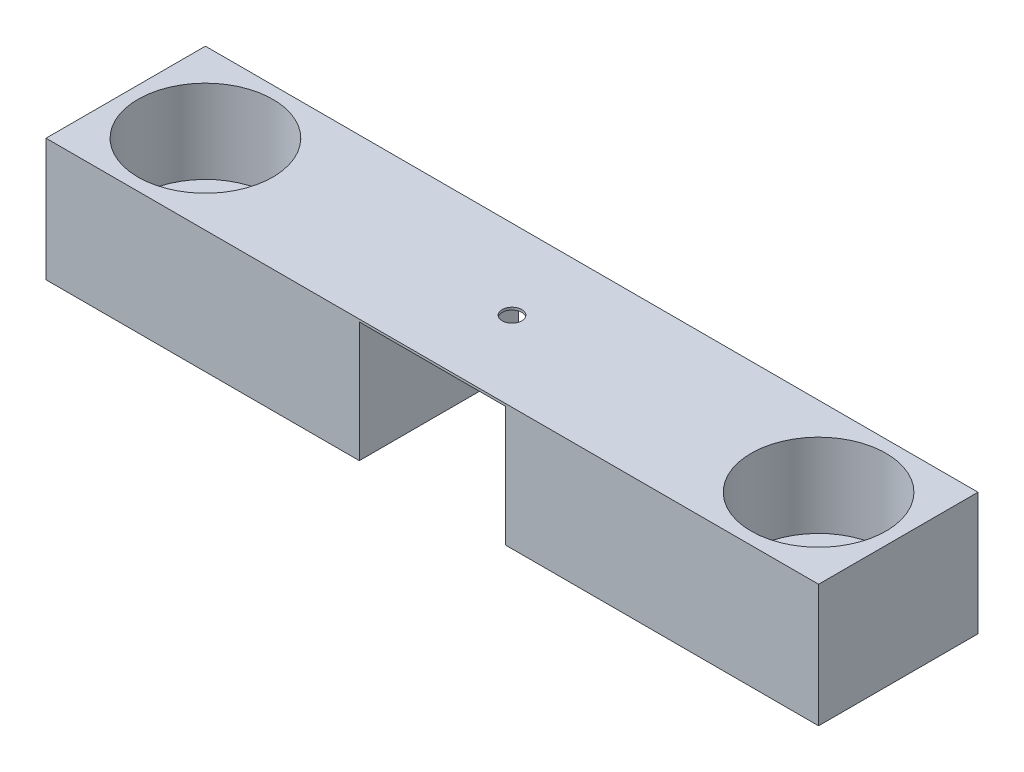
ISO-10303-21;
HEADER;
FILE_DESCRIPTION(('STEP AP214'),'2;1');
FILE_NAME('part.step','',(''),(''),'','','');
FILE_SCHEMA(('AUTOMOTIVE_DESIGN { 1 0 10303 214 1 1 1 1 }'));
ENDSEC;
DATA;
#1=APPLICATION_CONTEXT('core data for automotive mechanical design processes');
#2=APPLICATION_PROTOCOL_DEFINITION('international standard','automotive_design',2000,#1);
#3=PRODUCT_CONTEXT('',#1,'mechanical');
#4=PRODUCT('Part','Part','',(#3));
#5=PRODUCT_RELATED_PRODUCT_CATEGORY('part','',(#4));
#6=PRODUCT_DEFINITION_FORMATION('','',#4);
#7=PRODUCT_DEFINITION_CONTEXT('part definition',#1,'design');
#8=PRODUCT_DEFINITION('design','',#6,#7);
#9=PRODUCT_DEFINITION_SHAPE('','',#8);
#10=(LENGTH_UNIT() NAMED_UNIT(*) SI_UNIT(.MILLI.,.METRE.));
#11=(NAMED_UNIT(*) PLANE_ANGLE_UNIT() SI_UNIT($,.RADIAN.));
#12=(NAMED_UNIT(*) SI_UNIT($,.STERADIAN.) SOLID_ANGLE_UNIT());
#13=UNCERTAINTY_MEASURE_WITH_UNIT(LENGTH_MEASURE(1.E-05),#10,'distance_accuracy_value','');
#14=(GEOMETRIC_REPRESENTATION_CONTEXT(3) GLOBAL_UNCERTAINTY_ASSIGNED_CONTEXT((#13)) GLOBAL_UNIT_ASSIGNED_CONTEXT((#10,
#11,#12)) REPRESENTATION_CONTEXT('',''));
#15=CARTESIAN_POINT('',(0.,0.,0.));
#16=DIRECTION('',(0.,0.,1.));
#17=DIRECTION('',(1.,0.,0.));
#18=AXIS2_PLACEMENT_3D('',#15,#16,#17);
#19=CARTESIAN_POINT('',(0.,0.,0.));
#20=DIRECTION('',(0.,1.,0.));
#21=DIRECTION('',(0.,0.,1.));
#22=AXIS2_PLACEMENT_3D('',#19,#20,#21);
#23=PLANE('',#22);
#24=CARTESIAN_POINT('',(-25.,0.,0.));
#25=DIRECTION('',(0.,1.,0.));
#26=DIRECTION('',(0.,0.,1.));
#27=AXIS2_PLACEMENT_3D('',#24,#25,#26);
#28=CIRCLE('',#27,3.3);
#29=CARTESIAN_POINT('',(-25.,0.,3.3));
#30=VERTEX_POINT('',#29);
#31=EDGE_CURVE('E260',#30,#30,#28,.T.);
#32=ORIENTED_EDGE('',*,*,#31,.T.);
#33=EDGE_LOOP('',(#32));
#34=FACE_BOUND('',#33,.T.);
#35=CARTESIAN_POINT('',(-15.,0.,0.));
#36=DIRECTION('',(0.,-1.,0.));
#37=DIRECTION('',(0.,0.,-1.));
#38=AXIS2_PLACEMENT_3D('',#35,#36,#37);
#39=CIRCLE('',#38,1.99999999999999);
#40=CARTESIAN_POINT('',(-15.,0.,-1.99999999999999));
#41=VERTEX_POINT('',#40);
#42=EDGE_CURVE('E240',#41,#41,#39,.T.);
#43=ORIENTED_EDGE('',*,*,#42,.F.);
#44=EDGE_LOOP('',(#43));
#45=FACE_BOUND('',#44,.T.);
#46=DIRECTION('',(-1.,0.,0.));
#47=VECTOR('',#46,1.);
#48=CARTESIAN_POINT('',(-31.5,0.,-6.5));
#49=LINE('',#48,#47);
#50=CARTESIAN_POINT('',(-5.95,0.,-6.5));
#51=VERTEX_POINT('',#50);
#52=CARTESIAN_POINT('',(-31.5,0.,-6.5));
#53=VERTEX_POINT('',#52);
#54=EDGE_CURVE('E150',#51,#53,#49,.T.);
#55=ORIENTED_EDGE('',*,*,#54,.F.);
#56=DIRECTION('',(0.,0.,1.));
#57=VECTOR('',#56,1.);
#58=CARTESIAN_POINT('',(-5.95,0.,-6.5));
#59=LINE('',#58,#57);
#60=CARTESIAN_POINT('',(-5.95,0.,6.5));
#61=VERTEX_POINT('',#60);
#62=EDGE_CURVE('E133',#51,#61,#59,.T.);
#63=ORIENTED_EDGE('',*,*,#62,.T.);
#64=DIRECTION('',(1.,0.,0.));
#65=VECTOR('',#64,1.);
#66=CARTESIAN_POINT('',(-31.5,0.,6.5));
#67=LINE('',#66,#65);
#68=CARTESIAN_POINT('',(-31.5,0.,6.5));
#69=VERTEX_POINT('',#68);
#70=EDGE_CURVE('E168',#69,#61,#67,.T.);
#71=ORIENTED_EDGE('',*,*,#70,.F.);
#72=DIRECTION('',(0.,0.,1.));
#73=VECTOR('',#72,1.);
#74=CARTESIAN_POINT('',(-31.5,0.,-6.5));
#75=LINE('',#74,#73);
#76=EDGE_CURVE('E156',#53,#69,#75,.T.);
#77=ORIENTED_EDGE('',*,*,#76,.F.);
#78=EDGE_LOOP('',(#55,#63,#71,#77));
#79=FACE_BOUND('',#78,.T.);
#80=ADVANCED_FACE('F40',(#34,#45,#79),#23,.F.);
#81=CARTESIAN_POINT('',(31.5,10.,-6.5));
#82=DIRECTION('',(-1.,0.,0.));
#83=DIRECTION('',(0.,0.,1.));
#84=AXIS2_PLACEMENT_3D('',#81,#82,#83);
#85=PLANE('',#84);
#86=DIRECTION('',(0.,0.,-1.));
#87=VECTOR('',#86,1.);
#88=CARTESIAN_POINT('',(31.5,0.,-6.5));
#89=LINE('',#88,#87);
#90=CARTESIAN_POINT('',(31.5,0.,6.5));
#91=VERTEX_POINT('',#90);
#92=CARTESIAN_POINT('',(31.5,0.,-6.5));
#93=VERTEX_POINT('',#92);
#94=EDGE_CURVE('E158',#91,#93,#89,.T.);
#95=ORIENTED_EDGE('',*,*,#94,.T.);
#96=DIRECTION('',(0.,-1.,0.));
#97=VECTOR('',#96,1.);
#98=CARTESIAN_POINT('',(31.5,10.,-6.5));
#99=LINE('',#98,#97);
#100=CARTESIAN_POINT('',(31.5,10.,-6.5));
#101=VERTEX_POINT('',#100);
#102=EDGE_CURVE('E11',#101,#93,#99,.T.);
#103=ORIENTED_EDGE('',*,*,#102,.F.);
#104=DIRECTION('',(0.,0.,-1.));
#105=VECTOR('',#104,1.);
#106=CARTESIAN_POINT('',(31.5,10.,-6.5));
#107=LINE('',#106,#105);
#108=CARTESIAN_POINT('',(31.5,10.,6.5));
#109=VERTEX_POINT('',#108);
#110=EDGE_CURVE('E170',#109,#101,#107,.T.);
#111=ORIENTED_EDGE('',*,*,#110,.F.);
#112=DIRECTION('',(0.,-1.,0.));
#113=VECTOR('',#112,1.);
#114=CARTESIAN_POINT('',(31.5,10.,6.5));
#115=LINE('',#114,#113);
#116=EDGE_CURVE('E171',#109,#91,#115,.T.);
#117=ORIENTED_EDGE('',*,*,#116,.T.);
#118=EDGE_LOOP('',(#95,#103,#111,#117));
#119=FACE_BOUND('',#118,.T.);
#120=ADVANCED_FACE('F42',(#119),#85,.F.);
#121=CARTESIAN_POINT('',(-31.5,10.,-6.5));
#122=DIRECTION('',(0.,0.,1.));
#123=DIRECTION('',(1.,0.,0.));
#124=AXIS2_PLACEMENT_3D('',#121,#122,#123);
#125=PLANE('',#124);
#126=DIRECTION('',(-1.,0.,0.));
#127=VECTOR('',#126,1.);
#128=CARTESIAN_POINT('',(-5.95,9.8,-6.5));
#129=LINE('',#128,#127);
#130=CARTESIAN_POINT('',(5.95,9.8,-6.5));
#131=VERTEX_POINT('',#130);
#132=CARTESIAN_POINT('',(-5.95,9.8,-6.5));
#133=VERTEX_POINT('',#132);
#134=EDGE_CURVE('E145',#131,#133,#129,.T.);
#135=ORIENTED_EDGE('',*,*,#134,.T.);
#136=DIRECTION('',(0.,-1.,0.));
#137=VECTOR('',#136,1.);
#138=CARTESIAN_POINT('',(-5.95,9.8,-6.5));
#139=LINE('',#138,#137);
#140=EDGE_CURVE('E136',#133,#51,#139,.T.);
#141=ORIENTED_EDGE('',*,*,#140,.T.);
#142=ORIENTED_EDGE('',*,*,#54,.T.);
#143=DIRECTION('',(0.,-1.,0.));
#144=VECTOR('',#143,1.);
#145=CARTESIAN_POINT('',(-31.5,10.,-6.5));
#146=LINE('',#145,#144);
#147=CARTESIAN_POINT('',(-31.5,10.,-6.5));
#148=VERTEX_POINT('',#147);
#149=EDGE_CURVE('E49',#148,#53,#146,.T.);
#150=ORIENTED_EDGE('',*,*,#149,.F.);
#151=DIRECTION('',(-1.,0.,0.));
#152=VECTOR('',#151,1.);
#153=CARTESIAN_POINT('',(-31.5,10.,-6.5));
#154=LINE('',#153,#152);
#155=EDGE_CURVE('E183',#101,#148,#154,.T.);
#156=ORIENTED_EDGE('',*,*,#155,.F.);
#157=ORIENTED_EDGE('',*,*,#102,.T.);
#158=CARTESIAN_POINT('',(5.95,0.,-6.5));
#159=VERTEX_POINT('',#158);
#160=EDGE_CURVE('E157',#93,#159,#49,.T.);
#161=ORIENTED_EDGE('',*,*,#160,.T.);
#162=DIRECTION('',(0.,1.,0.));
#163=VECTOR('',#162,1.);
#164=CARTESIAN_POINT('',(5.95,9.8,-6.5));
#165=LINE('',#164,#163);
#166=EDGE_CURVE('E56',#159,#131,#165,.T.);
#167=ORIENTED_EDGE('',*,*,#166,.T.);
#168=EDGE_LOOP('',(#135,#141,#142,#150,#156,#157,#161,#167));
#169=FACE_BOUND('',#168,.T.);
#170=ADVANCED_FACE('F148',(#169),#125,.F.);
#171=CARTESIAN_POINT('',(-31.5,10.,-6.5));
#172=DIRECTION('',(1.,0.,0.));
#173=DIRECTION('',(0.,0.,-1.));
#174=AXIS2_PLACEMENT_3D('',#171,#172,#173);
#175=PLANE('',#174);
#176=ORIENTED_EDGE('',*,*,#76,.T.);
#177=DIRECTION('',(0.,-1.,0.));
#178=VECTOR('',#177,1.);
#179=CARTESIAN_POINT('',(-31.5,10.,6.5));
#180=LINE('',#179,#178);
#181=CARTESIAN_POINT('',(-31.5,10.,6.5));
#182=VERTEX_POINT('',#181);
#183=EDGE_CURVE('E174',#182,#69,#180,.T.);
#184=ORIENTED_EDGE('',*,*,#183,.F.);
#185=DIRECTION('',(0.,0.,1.));
#186=VECTOR('',#185,1.);
#187=CARTESIAN_POINT('',(-31.5,10.,-6.5));
#188=LINE('',#187,#186);
#189=EDGE_CURVE('E182',#148,#182,#188,.T.);
#190=ORIENTED_EDGE('',*,*,#189,.F.);
#191=ORIENTED_EDGE('',*,*,#149,.T.);
#192=EDGE_LOOP('',(#176,#184,#190,#191));
#193=FACE_BOUND('',#192,.T.);
#194=ADVANCED_FACE('F180',(#193),#175,.F.);
#195=CARTESIAN_POINT('',(-31.5,10.,6.5));
#196=DIRECTION('',(0.,0.,-1.));
#197=DIRECTION('',(-1.,0.,0.));
#198=AXIS2_PLACEMENT_3D('',#195,#196,#197);
#199=PLANE('',#198);
#200=ORIENTED_EDGE('',*,*,#70,.T.);
#201=DIRECTION('',(0.,-1.,0.));
#202=VECTOR('',#201,1.);
#203=CARTESIAN_POINT('',(-5.95,9.8,6.5));
#204=LINE('',#203,#202);
#205=CARTESIAN_POINT('',(-5.95,9.8,6.5));
#206=VERTEX_POINT('',#205);
#207=EDGE_CURVE('E139',#206,#61,#204,.T.);
#208=ORIENTED_EDGE('',*,*,#207,.F.);
#209=DIRECTION('',(-1.,0.,0.));
#210=VECTOR('',#209,1.);
#211=CARTESIAN_POINT('',(-5.95,9.8,6.5));
#212=LINE('',#211,#210);
#213=CARTESIAN_POINT('',(5.95,9.8,6.5));
#214=VERTEX_POINT('',#213);
#215=EDGE_CURVE('E153',#214,#206,#212,.T.);
#216=ORIENTED_EDGE('',*,*,#215,.F.);
#217=DIRECTION('',(0.,1.,0.));
#218=VECTOR('',#217,1.);
#219=CARTESIAN_POINT('',(5.95,9.8,6.5));
#220=LINE('',#219,#218);
#221=CARTESIAN_POINT('',(5.95,0.,6.5));
#222=VERTEX_POINT('',#221);
#223=EDGE_CURVE('E202',#222,#214,#220,.T.);
#224=ORIENTED_EDGE('',*,*,#223,.F.);
#225=EDGE_CURVE('E167',#222,#91,#67,.T.);
#226=ORIENTED_EDGE('',*,*,#225,.T.);
#227=ORIENTED_EDGE('',*,*,#116,.F.);
#228=DIRECTION('',(1.,0.,0.));
#229=VECTOR('',#228,1.);
#230=CARTESIAN_POINT('',(-31.5,10.,6.5));
#231=LINE('',#230,#229);
#232=EDGE_CURVE('E175',#182,#109,#231,.T.);
#233=ORIENTED_EDGE('',*,*,#232,.F.);
#234=ORIENTED_EDGE('',*,*,#183,.T.);
#235=EDGE_LOOP('',(#200,#208,#216,#224,#226,#227,#233,#234));
#236=FACE_BOUND('',#235,.T.);
#237=ADVANCED_FACE('F275',(#236),#199,.F.);
#238=CARTESIAN_POINT('',(0.,10.,0.));
#239=DIRECTION('',(0.,1.,0.));
#240=DIRECTION('',(0.,0.,1.));
#241=AXIS2_PLACEMENT_3D('',#238,#239,#240);
#242=PLANE('',#241);
#243=CARTESIAN_POINT('',(0.,10.,0.));
#244=DIRECTION('',(0.,1.,0.));
#245=DIRECTION('',(0.,0.,1.));
#246=AXIS2_PLACEMENT_3D('',#243,#244,#245);
#247=CIRCLE('',#246,0.799999999999999);
#248=CARTESIAN_POINT('',(0.,10.,0.799999999999994));
#249=VERTEX_POINT('',#248);
#250=EDGE_CURVE('E212',#249,#249,#247,.T.);
#251=ORIENTED_EDGE('',*,*,#250,.F.);
#252=EDGE_LOOP('',(#251));
#253=FACE_BOUND('',#252,.T.);
#254=CARTESIAN_POINT('',(-25.,10.,0.));
#255=DIRECTION('',(0.,1.,0.));
#256=DIRECTION('',(0.,0.,1.));
#257=AXIS2_PLACEMENT_3D('',#254,#255,#256);
#258=CIRCLE('',#257,5.49999999999999);
#259=CARTESIAN_POINT('',(-25.,10.,5.49999999999999));
#260=VERTEX_POINT('',#259);
#261=EDGE_CURVE('E251',#260,#260,#258,.T.);
#262=ORIENTED_EDGE('',*,*,#261,.F.);
#263=EDGE_LOOP('',(#262));
#264=FACE_BOUND('',#263,.T.);
#265=CARTESIAN_POINT('',(25.,10.,0.));
#266=DIRECTION('',(0.,1.,0.));
#267=DIRECTION('',(0.,0.,1.));
#268=AXIS2_PLACEMENT_3D('',#265,#266,#267);
#269=CIRCLE('',#268,5.49999999999999);
#270=CARTESIAN_POINT('',(25.,10.,5.49999999999998));
#271=VERTEX_POINT('',#270);
#272=EDGE_CURVE('E263',#271,#271,#269,.T.);
#273=ORIENTED_EDGE('',*,*,#272,.F.);
#274=EDGE_LOOP('',(#273));
#275=FACE_BOUND('',#274,.T.);
#276=ORIENTED_EDGE('',*,*,#110,.T.);
#277=ORIENTED_EDGE('',*,*,#155,.T.);
#278=ORIENTED_EDGE('',*,*,#189,.T.);
#279=ORIENTED_EDGE('',*,*,#232,.T.);
#280=EDGE_LOOP('',(#276,#277,#278,#279));
#281=FACE_BOUND('',#280,.T.);
#282=ADVANCED_FACE('F189',(#253,#264,#275,#281),#242,.T.);
#283=DIRECTION('',(1.,0.,0.));
#284=VECTOR('',#283,1.);
#285=CARTESIAN_POINT('',(14.5,0.,-2.));
#286=LINE('',#285,#284);
#287=CARTESIAN_POINT('',(14.5,0.,-2.));
#288=VERTEX_POINT('',#287);
#289=CARTESIAN_POINT('',(15.5,0.,-2.));
#290=VERTEX_POINT('',#289);
#291=EDGE_CURVE('E230',#288,#290,#286,.T.);
#292=ORIENTED_EDGE('',*,*,#291,.F.);
#293=CARTESIAN_POINT('',(14.5,0.,0.));
#294=DIRECTION('',(0.,-1.,0.));
#295=DIRECTION('',(0.,0.,-1.));
#296=AXIS2_PLACEMENT_3D('',#293,#294,#295);
#297=CIRCLE('',#296,2.);
#298=CARTESIAN_POINT('',(14.5,0.,2.));
#299=VERTEX_POINT('',#298);
#300=EDGE_CURVE('E64',#299,#288,#297,.T.);
#301=ORIENTED_EDGE('',*,*,#300,.F.);
#302=DIRECTION('',(-1.,0.,0.));
#303=VECTOR('',#302,1.);
#304=CARTESIAN_POINT('',(14.5,0.,2.));
#305=LINE('',#304,#303);
#306=CARTESIAN_POINT('',(15.5,0.,2.));
#307=VERTEX_POINT('',#306);
#308=EDGE_CURVE('E219',#307,#299,#305,.T.);
#309=ORIENTED_EDGE('',*,*,#308,.F.);
#310=CARTESIAN_POINT('',(15.5,0.,0.));
#311=DIRECTION('',(0.,-1.,0.));
#312=DIRECTION('',(0.,0.,-1.));
#313=AXIS2_PLACEMENT_3D('',#310,#311,#312);
#314=CIRCLE('',#313,2.);
#315=EDGE_CURVE('E233',#290,#307,#314,.T.);
#316=ORIENTED_EDGE('',*,*,#315,.F.);
#317=EDGE_LOOP('',(#292,#301,#309,#316));
#318=FACE_BOUND('',#317,.T.);
#319=CARTESIAN_POINT('',(25.,0.,0.));
#320=DIRECTION('',(0.,1.,0.));
#321=DIRECTION('',(0.,0.,1.));
#322=AXIS2_PLACEMENT_3D('',#319,#320,#321);
#323=CIRCLE('',#322,3.3);
#324=CARTESIAN_POINT('',(25.,0.,3.29999999999999));
#325=VERTEX_POINT('',#324);
#326=EDGE_CURVE('E162',#325,#325,#323,.T.);
#327=ORIENTED_EDGE('',*,*,#326,.T.);
#328=EDGE_LOOP('',(#327));
#329=FACE_BOUND('',#328,.T.);
#330=ORIENTED_EDGE('',*,*,#225,.F.);
#331=DIRECTION('',(0.,0.,1.));
#332=VECTOR('',#331,1.);
#333=CARTESIAN_POINT('',(5.95,0.,-6.5));
#334=LINE('',#333,#332);
#335=EDGE_CURVE('E144',#159,#222,#334,.T.);
#336=ORIENTED_EDGE('',*,*,#335,.F.);
#337=ORIENTED_EDGE('',*,*,#160,.F.);
#338=ORIENTED_EDGE('',*,*,#94,.F.);
#339=EDGE_LOOP('',(#330,#336,#337,#338));
#340=FACE_BOUND('',#339,.T.);
#341=ADVANCED_FACE('F197',(#318,#329,#340),#23,.F.);
#342=CARTESIAN_POINT('',(25.,10.,0.));
#343=DIRECTION('',(0.,1.,0.));
#344=DIRECTION('',(0.,0.,1.));
#345=AXIS2_PLACEMENT_3D('',#342,#343,#344);
#346=CYLINDRICAL_SURFACE('',#345,3.3);
#347=ORIENTED_EDGE('',*,*,#326,.F.);
#348=EDGE_LOOP('',(#347));
#349=FACE_BOUND('',#348,.T.);
#350=CARTESIAN_POINT('',(25.,3.2,0.));
#351=DIRECTION('',(0.,1.,0.));
#352=DIRECTION('',(0.,0.,1.));
#353=AXIS2_PLACEMENT_3D('',#350,#351,#352);
#354=CIRCLE('',#353,3.3);
#355=CARTESIAN_POINT('',(25.,3.2,3.29999999999999));
#356=VERTEX_POINT('',#355);
#357=EDGE_CURVE('E269',#356,#356,#354,.T.);
#358=ORIENTED_EDGE('',*,*,#357,.T.);
#359=EDGE_LOOP('',(#358));
#360=FACE_BOUND('',#359,.T.);
#361=ADVANCED_FACE('F314',(#349,#360),#346,.F.);
#362=CARTESIAN_POINT('',(28.3,3.2,0.));
#363=DIRECTION('',(0.,-1.,0.));
#364=DIRECTION('',(0.,0.,-1.));
#365=AXIS2_PLACEMENT_3D('',#362,#363,#364);
#366=PLANE('',#365);
#367=ORIENTED_EDGE('',*,*,#357,.F.);
#368=EDGE_LOOP('',(#367));
#369=FACE_BOUND('',#368,.T.);
#370=CARTESIAN_POINT('',(25.,3.2,0.));
#371=DIRECTION('',(0.,1.,0.));
#372=DIRECTION('',(0.,0.,1.));
#373=AXIS2_PLACEMENT_3D('',#370,#371,#372);
#374=CIRCLE('',#373,5.5);
#375=CARTESIAN_POINT('',(25.,3.2,5.49999999999999));
#376=VERTEX_POINT('',#375);
#377=EDGE_CURVE('E266',#376,#376,#374,.T.);
#378=ORIENTED_EDGE('',*,*,#377,.T.);
#379=EDGE_LOOP('',(#378));
#380=FACE_BOUND('',#379,.T.);
#381=ADVANCED_FACE('F304',(#369,#380),#366,.F.);
#382=CARTESIAN_POINT('',(25.,10.,0.));
#383=DIRECTION('',(0.,1.,0.));
#384=DIRECTION('',(0.,0.,1.));
#385=AXIS2_PLACEMENT_3D('',#382,#383,#384);
#386=CYLINDRICAL_SURFACE('',#385,5.5);
#387=ORIENTED_EDGE('',*,*,#377,.F.);
#388=EDGE_LOOP('',(#387));
#389=FACE_BOUND('',#388,.T.);
#390=ORIENTED_EDGE('',*,*,#272,.T.);
#391=EDGE_LOOP('',(#390));
#392=FACE_BOUND('',#391,.T.);
#393=ADVANCED_FACE('F301',(#389,#392),#386,.F.);
#394=CARTESIAN_POINT('',(-25.,10.,0.));
#395=DIRECTION('',(0.,1.,0.));
#396=DIRECTION('',(0.,0.,1.));
#397=AXIS2_PLACEMENT_3D('',#394,#395,#396);
#398=CYLINDRICAL_SURFACE('',#397,3.3);
#399=ORIENTED_EDGE('',*,*,#31,.F.);
#400=EDGE_LOOP('',(#399));
#401=FACE_BOUND('',#400,.T.);
#402=CARTESIAN_POINT('',(-25.,3.2,0.));
#403=DIRECTION('',(0.,1.,0.));
#404=DIRECTION('',(0.,0.,1.));
#405=AXIS2_PLACEMENT_3D('',#402,#403,#404);
#406=CIRCLE('',#405,3.3);
#407=CARTESIAN_POINT('',(-25.,3.2,3.3));
#408=VERTEX_POINT('',#407);
#409=EDGE_CURVE('E257',#408,#408,#406,.T.);
#410=ORIENTED_EDGE('',*,*,#409,.T.);
#411=EDGE_LOOP('',(#410));
#412=FACE_BOUND('',#411,.T.);
#413=ADVANCED_FACE('F303',(#401,#412),#398,.F.);
#414=CARTESIAN_POINT('',(-21.7,3.2,0.));
#415=DIRECTION('',(0.,-1.,0.));
#416=DIRECTION('',(0.,0.,-1.));
#417=AXIS2_PLACEMENT_3D('',#414,#415,#416);
#418=PLANE('',#417);
#419=ORIENTED_EDGE('',*,*,#409,.F.);
#420=EDGE_LOOP('',(#419));
#421=FACE_BOUND('',#420,.T.);
#422=CARTESIAN_POINT('',(-25.,3.2,0.));
#423=DIRECTION('',(0.,1.,0.));
#424=DIRECTION('',(0.,0.,1.));
#425=AXIS2_PLACEMENT_3D('',#422,#423,#424);
#426=CIRCLE('',#425,5.5);
#427=CARTESIAN_POINT('',(-25.,3.2,5.5));
#428=VERTEX_POINT('',#427);
#429=EDGE_CURVE('E254',#428,#428,#426,.T.);
#430=ORIENTED_EDGE('',*,*,#429,.T.);
#431=EDGE_LOOP('',(#430));
#432=FACE_BOUND('',#431,.T.);
#433=ADVANCED_FACE('F311',(#421,#432),#418,.F.);
#434=CARTESIAN_POINT('',(-25.,10.,0.));
#435=DIRECTION('',(0.,1.,0.));
#436=DIRECTION('',(0.,0.,1.));
#437=AXIS2_PLACEMENT_3D('',#434,#435,#436);
#438=CYLINDRICAL_SURFACE('',#437,5.5);
#439=ORIENTED_EDGE('',*,*,#429,.F.);
#440=EDGE_LOOP('',(#439));
#441=FACE_BOUND('',#440,.T.);
#442=ORIENTED_EDGE('',*,*,#261,.T.);
#443=EDGE_LOOP('',(#442));
#444=FACE_BOUND('',#443,.T.);
#445=ADVANCED_FACE('F372',(#441,#444),#438,.F.);
#446=CARTESIAN_POINT('',(-15.,5.,0.));
#447=DIRECTION('',(0.,-1.,0.));
#448=DIRECTION('',(0.,0.,-1.));
#449=AXIS2_PLACEMENT_3D('',#446,#447,#448);
#450=CONICAL_SURFACE('',#449,2.,1.02974425867665);
#451=CARTESIAN_POINT('',(-15.,6.20172123805512,0.));
#452=VERTEX_POINT('',#451);
#453=VERTEX_LOOP('',#452);
#454=FACE_BOUND('',#453,.T.);
#455=CARTESIAN_POINT('',(-15.,5.,0.));
#456=DIRECTION('',(0.,-1.,0.));
#457=DIRECTION('',(0.,0.,-1.));
#458=AXIS2_PLACEMENT_3D('',#455,#456,#457);
#459=CIRCLE('',#458,2.);
#460=CARTESIAN_POINT('',(-15.,5.,-2.));
#461=VERTEX_POINT('',#460);
#462=EDGE_CURVE('E248',#461,#461,#459,.T.);
#463=ORIENTED_EDGE('',*,*,#462,.T.);
#464=EDGE_LOOP('',(#463));
#465=FACE_BOUND('',#464,.T.);
#466=ADVANCED_FACE('F368',(#454,#465),#450,.F.);
#467=CARTESIAN_POINT('',(-15.,0.,0.));
#468=DIRECTION('',(0.,-1.,0.));
#469=DIRECTION('',(0.,0.,-1.));
#470=AXIS2_PLACEMENT_3D('',#467,#468,#469);
#471=CYLINDRICAL_SURFACE('',#470,1.99999999999999);
#472=ORIENTED_EDGE('',*,*,#462,.F.);
#473=EDGE_LOOP('',(#472));
#474=FACE_BOUND('',#473,.T.);
#475=ORIENTED_EDGE('',*,*,#42,.T.);
#476=EDGE_LOOP('',(#475));
#477=FACE_BOUND('',#476,.T.);
#478=ADVANCED_FACE('F365',(#474,#477),#471,.F.);
#479=CARTESIAN_POINT('',(14.5,5.,0.));
#480=DIRECTION('',(0.,-1.,0.));
#481=DIRECTION('',(0.,0.,-1.));
#482=AXIS2_PLACEMENT_3D('',#479,#480,#481);
#483=CYLINDRICAL_SURFACE('',#482,2.);
#484=ORIENTED_EDGE('',*,*,#300,.T.);
#485=DIRECTION('',(0.,-1.,0.));
#486=VECTOR('',#485,1.);
#487=CARTESIAN_POINT('',(14.5,5.,-2.));
#488=LINE('',#487,#486);
#489=CARTESIAN_POINT('',(14.5,5.,-2.));
#490=VERTEX_POINT('',#489);
#491=EDGE_CURVE('E228',#490,#288,#488,.T.);
#492=ORIENTED_EDGE('',*,*,#491,.F.);
#493=CARTESIAN_POINT('',(14.5,5.,0.));
#494=DIRECTION('',(0.,-1.,0.));
#495=DIRECTION('',(0.,0.,-1.));
#496=AXIS2_PLACEMENT_3D('',#493,#494,#495);
#497=CIRCLE('',#496,2.);
#498=CARTESIAN_POINT('',(14.5,5.,2.));
#499=VERTEX_POINT('',#498);
#500=EDGE_CURVE('E215',#499,#490,#497,.T.);
#501=ORIENTED_EDGE('',*,*,#500,.F.);
#502=DIRECTION('',(0.,-1.,0.));
#503=VECTOR('',#502,1.);
#504=CARTESIAN_POINT('',(14.5,5.,2.));
#505=LINE('',#504,#503);
#506=EDGE_CURVE('E238',#499,#299,#505,.T.);
#507=ORIENTED_EDGE('',*,*,#506,.T.);
#508=EDGE_LOOP('',(#484,#492,#501,#507));
#509=FACE_BOUND('',#508,.T.);
#510=ADVANCED_FACE('F346',(#509),#483,.F.);
#511=CARTESIAN_POINT('',(14.5,5.,2.));
#512=DIRECTION('',(0.,0.,1.));
#513=DIRECTION('',(1.,0.,0.));
#514=AXIS2_PLACEMENT_3D('',#511,#512,#513);
#515=PLANE('',#514);
#516=ORIENTED_EDGE('',*,*,#308,.T.);
#517=ORIENTED_EDGE('',*,*,#506,.F.);
#518=DIRECTION('',(-1.,0.,0.));
#519=VECTOR('',#518,1.);
#520=CARTESIAN_POINT('',(14.5,5.,2.));
#521=LINE('',#520,#519);
#522=CARTESIAN_POINT('',(15.5,5.,2.));
#523=VERTEX_POINT('',#522);
#524=EDGE_CURVE('E225',#523,#499,#521,.T.);
#525=ORIENTED_EDGE('',*,*,#524,.F.);
#526=DIRECTION('',(0.,-1.,0.));
#527=VECTOR('',#526,1.);
#528=CARTESIAN_POINT('',(15.5,5.,2.));
#529=LINE('',#528,#527);
#530=EDGE_CURVE('E241',#523,#307,#529,.T.);
#531=ORIENTED_EDGE('',*,*,#530,.T.);
#532=EDGE_LOOP('',(#516,#517,#525,#531));
#533=FACE_BOUND('',#532,.T.);
#534=ADVANCED_FACE('F350',(#533),#515,.F.);
#535=CARTESIAN_POINT('',(15.5,5.,0.));
#536=DIRECTION('',(0.,-1.,0.));
#537=DIRECTION('',(0.,0.,-1.));
#538=AXIS2_PLACEMENT_3D('',#535,#536,#537);
#539=CYLINDRICAL_SURFACE('',#538,2.);
#540=ORIENTED_EDGE('',*,*,#315,.T.);
#541=ORIENTED_EDGE('',*,*,#530,.F.);
#542=CARTESIAN_POINT('',(15.5,5.,0.));
#543=DIRECTION('',(0.,-1.,0.));
#544=DIRECTION('',(0.,0.,-1.));
#545=AXIS2_PLACEMENT_3D('',#542,#543,#544);
#546=CIRCLE('',#545,2.);
#547=CARTESIAN_POINT('',(15.5,5.,-2.));
#548=VERTEX_POINT('',#547);
#549=EDGE_CURVE('E222',#548,#523,#546,.T.);
#550=ORIENTED_EDGE('',*,*,#549,.F.);
#551=DIRECTION('',(0.,-1.,0.));
#552=VECTOR('',#551,1.);
#553=CARTESIAN_POINT('',(15.5,5.,-2.));
#554=LINE('',#553,#552);
#555=EDGE_CURVE('E243',#548,#290,#554,.T.);
#556=ORIENTED_EDGE('',*,*,#555,.T.);
#557=EDGE_LOOP('',(#540,#541,#550,#556));
#558=FACE_BOUND('',#557,.T.);
#559=ADVANCED_FACE('F352',(#558),#539,.F.);
#560=CARTESIAN_POINT('',(14.5,5.,-2.));
#561=DIRECTION('',(0.,0.,-1.));
#562=DIRECTION('',(-1.,0.,0.));
#563=AXIS2_PLACEMENT_3D('',#560,#561,#562);
#564=PLANE('',#563);
#565=ORIENTED_EDGE('',*,*,#291,.T.);
#566=ORIENTED_EDGE('',*,*,#555,.F.);
#567=DIRECTION('',(1.,0.,0.));
#568=VECTOR('',#567,1.);
#569=CARTESIAN_POINT('',(14.5,5.,-2.));
#570=LINE('',#569,#568);
#571=EDGE_CURVE('E218',#490,#548,#570,.T.);
#572=ORIENTED_EDGE('',*,*,#571,.F.);
#573=ORIENTED_EDGE('',*,*,#491,.T.);
#574=EDGE_LOOP('',(#565,#566,#572,#573));
#575=FACE_BOUND('',#574,.T.);
#576=ADVANCED_FACE('F342',(#575),#564,.F.);
#577=CARTESIAN_POINT('',(14.5,5.,0.));
#578=DIRECTION('',(0.,-1.,0.));
#579=DIRECTION('',(0.,0.,-1.));
#580=AXIS2_PLACEMENT_3D('',#577,#578,#579);
#581=PLANE('',#580);
#582=ORIENTED_EDGE('',*,*,#500,.T.);
#583=ORIENTED_EDGE('',*,*,#571,.T.);
#584=ORIENTED_EDGE('',*,*,#549,.T.);
#585=ORIENTED_EDGE('',*,*,#524,.T.);
#586=EDGE_LOOP('',(#582,#583,#584,#585));
#587=FACE_BOUND('',#586,.T.);
#588=ADVANCED_FACE('F290',(#587),#581,.T.);
#589=CARTESIAN_POINT('',(0.,10.,0.));
#590=DIRECTION('',(0.,1.,0.));
#591=DIRECTION('',(0.,0.,1.));
#592=AXIS2_PLACEMENT_3D('',#589,#590,#591);
#593=CYLINDRICAL_SURFACE('',#592,0.799999999999998);
#594=CARTESIAN_POINT('',(0.,9.8,0.));
#595=DIRECTION('',(0.,1.,0.));
#596=DIRECTION('',(-1.,0.,0.));
#597=AXIS2_PLACEMENT_3D('',#594,#595,#596);
#598=CIRCLE('',#597,0.799999999999998);
#599=CARTESIAN_POINT('',(-0.799999999999998,9.8,0.));
#600=VERTEX_POINT('',#599);
#601=EDGE_CURVE('E44',#600,#600,#598,.F.);
#602=ORIENTED_EDGE('',*,*,#601,.T.);
#603=EDGE_LOOP('',(#602));
#604=FACE_BOUND('',#603,.T.);
#605=ORIENTED_EDGE('',*,*,#250,.T.);
#606=EDGE_LOOP('',(#605));
#607=FACE_BOUND('',#606,.T.);
#608=ADVANCED_FACE('F283',(#604,#607),#593,.F.);
#609=CARTESIAN_POINT('',(-5.95,9.8,-6.5));
#610=DIRECTION('',(0.,1.,0.));
#611=DIRECTION('',(-1.,0.,0.));
#612=AXIS2_PLACEMENT_3D('',#609,#610,#611);
#613=PLANE('',#612);
#614=ORIENTED_EDGE('',*,*,#215,.T.);
#615=DIRECTION('',(0.,0.,1.));
#616=VECTOR('',#615,1.);
#617=CARTESIAN_POINT('',(-5.95,9.8,-6.5));
#618=LINE('',#617,#616);
#619=EDGE_CURVE('E207',#133,#206,#618,.T.);
#620=ORIENTED_EDGE('',*,*,#619,.F.);
#621=ORIENTED_EDGE('',*,*,#134,.F.);
#622=DIRECTION('',(0.,0.,1.));
#623=VECTOR('',#622,1.);
#624=CARTESIAN_POINT('',(5.95,9.8,-6.5));
#625=LINE('',#624,#623);
#626=EDGE_CURVE('E209',#131,#214,#625,.T.);
#627=ORIENTED_EDGE('',*,*,#626,.T.);
#628=EDGE_LOOP('',(#614,#620,#621,#627));
#629=FACE_BOUND('',#628,.T.);
#630=ORIENTED_EDGE('',*,*,#601,.F.);
#631=EDGE_LOOP('',(#630));
#632=FACE_BOUND('',#631,.T.);
#633=ADVANCED_FACE('F280',(#629,#632),#613,.F.);
#634=CARTESIAN_POINT('',(-5.95,9.8,-6.5));
#635=DIRECTION('',(-1.,0.,0.));
#636=DIRECTION('',(0.,-1.,0.));
#637=AXIS2_PLACEMENT_3D('',#634,#635,#636);
#638=PLANE('',#637);
#639=ORIENTED_EDGE('',*,*,#207,.T.);
#640=ORIENTED_EDGE('',*,*,#62,.F.);
#641=ORIENTED_EDGE('',*,*,#140,.F.);
#642=ORIENTED_EDGE('',*,*,#619,.T.);
#643=EDGE_LOOP('',(#639,#640,#641,#642));
#644=FACE_BOUND('',#643,.T.);
#645=ADVANCED_FACE('F135',(#644),#638,.F.);
#646=CARTESIAN_POINT('',(5.95,9.8,-6.5));
#647=DIRECTION('',(1.,0.,0.));
#648=DIRECTION('',(0.,1.,0.));
#649=AXIS2_PLACEMENT_3D('',#646,#647,#648);
#650=PLANE('',#649);
#651=ORIENTED_EDGE('',*,*,#223,.T.);
#652=ORIENTED_EDGE('',*,*,#626,.F.);
#653=ORIENTED_EDGE('',*,*,#166,.F.);
#654=ORIENTED_EDGE('',*,*,#335,.T.);
#655=EDGE_LOOP('',(#651,#652,#653,#654));
#656=FACE_BOUND('',#655,.T.);
#657=ADVANCED_FACE('F278',(#656),#650,.F.);
#658=CLOSED_SHELL('',(#80,#120,#170,#194,#237,#282,#341,#361,#381,#393,#413,#433,#445,#466,#478,
#510,#534,#559,#576,#588,#608,#633,#645,#657));
#659=MANIFOLD_SOLID_BREP('B2',#658);
#660=ADVANCED_BREP_SHAPE_REPRESENTATION('',(#18,#659),#14);
#661=SHAPE_DEFINITION_REPRESENTATION(#9,#660);
ENDSEC;
END-ISO-10303-21;
